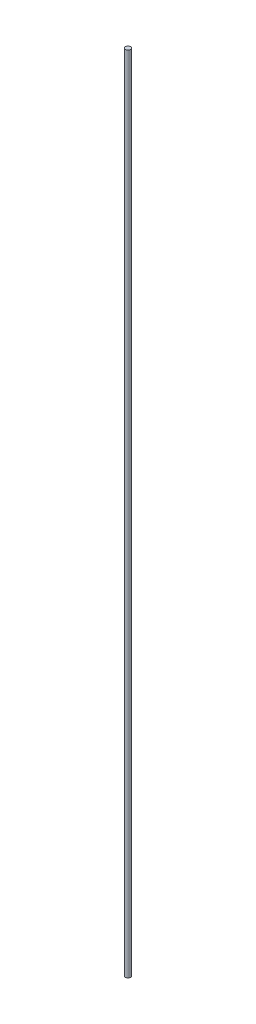
ISO-10303-21;
HEADER;
FILE_DESCRIPTION(('STEP AP214'),'2;1');
FILE_NAME('part.step','',(''),(''),'','','');
FILE_SCHEMA(('AUTOMOTIVE_DESIGN { 1 0 10303 214 1 1 1 1 }'));
ENDSEC;
DATA;
#1=APPLICATION_CONTEXT('core data for automotive mechanical design processes');
#2=APPLICATION_PROTOCOL_DEFINITION('international standard','automotive_design',2000,#1);
#3=PRODUCT_CONTEXT('',#1,'mechanical');
#4=PRODUCT('Part','Part','',(#3));
#5=PRODUCT_RELATED_PRODUCT_CATEGORY('part','',(#4));
#6=PRODUCT_DEFINITION_FORMATION('','',#4);
#7=PRODUCT_DEFINITION_CONTEXT('part definition',#1,'design');
#8=PRODUCT_DEFINITION('design','',#6,#7);
#9=PRODUCT_DEFINITION_SHAPE('','',#8);
#10=(LENGTH_UNIT() NAMED_UNIT(*) SI_UNIT(.MILLI.,.METRE.));
#11=(NAMED_UNIT(*) PLANE_ANGLE_UNIT() SI_UNIT($,.RADIAN.));
#12=(NAMED_UNIT(*) SI_UNIT($,.STERADIAN.) SOLID_ANGLE_UNIT());
#13=UNCERTAINTY_MEASURE_WITH_UNIT(LENGTH_MEASURE(1.E-05),#10,'distance_accuracy_value','');
#14=(GEOMETRIC_REPRESENTATION_CONTEXT(3) GLOBAL_UNCERTAINTY_ASSIGNED_CONTEXT((#13)) GLOBAL_UNIT_ASSIGNED_CONTEXT((#10,
#11,#12)) REPRESENTATION_CONTEXT('',''));
#15=CARTESIAN_POINT('',(0.,0.,0.));
#16=DIRECTION('',(0.,0.,1.));
#17=DIRECTION('',(1.,0.,0.));
#18=AXIS2_PLACEMENT_3D('',#15,#16,#17);
#19=CARTESIAN_POINT('',(0.,0.,0.));
#20=DIRECTION('',(0.,1.,0.));
#21=DIRECTION('',(0.,0.,1.));
#22=AXIS2_PLACEMENT_3D('',#19,#20,#21);
#23=PLANE('',#22);
#24=CARTESIAN_POINT('',(0.,0.,0.));
#25=DIRECTION('',(0.,1.,0.));
#26=DIRECTION('',(0.,0.,1.));
#27=AXIS2_PLACEMENT_3D('',#24,#25,#26);
#28=CIRCLE('',#27,6.35);
#29=CARTESIAN_POINT('',(0.,0.,6.35));
#30=VERTEX_POINT('',#29);
#31=EDGE_CURVE('E43',#30,#30,#28,.T.);
#32=ORIENTED_EDGE('',*,*,#31,.F.);
#33=EDGE_LOOP('',(#32));
#34=FACE_BOUND('',#33,.T.);
#35=ADVANCED_FACE('F37',(#34),#23,.F.);
#36=CARTESIAN_POINT('',(0.,1999.996,0.));
#37=DIRECTION('',(0.,1.,0.));
#38=DIRECTION('',(0.,0.,1.));
#39=AXIS2_PLACEMENT_3D('',#36,#37,#38);
#40=PLANE('',#39);
#41=CARTESIAN_POINT('',(0.,1999.996,0.));
#42=DIRECTION('',(0.,1.,0.));
#43=DIRECTION('',(0.,0.,1.));
#44=AXIS2_PLACEMENT_3D('',#41,#42,#43);
#45=CIRCLE('',#44,6.35);
#46=CARTESIAN_POINT('',(0.,1999.996,6.35));
#47=VERTEX_POINT('',#46);
#48=EDGE_CURVE('E11',#47,#47,#45,.T.);
#49=ORIENTED_EDGE('',*,*,#48,.T.);
#50=EDGE_LOOP('',(#49));
#51=FACE_BOUND('',#50,.T.);
#52=ADVANCED_FACE('F52',(#51),#40,.T.);
#53=CARTESIAN_POINT('',(0.,0.,0.));
#54=DIRECTION('',(0.,1.,0.));
#55=DIRECTION('',(0.,0.,1.));
#56=AXIS2_PLACEMENT_3D('',#53,#54,#55);
#57=CYLINDRICAL_SURFACE('',#56,6.35);
#58=ORIENTED_EDGE('',*,*,#48,.F.);
#59=EDGE_LOOP('',(#58));
#60=FACE_BOUND('',#59,.T.);
#61=ORIENTED_EDGE('',*,*,#31,.T.);
#62=EDGE_LOOP('',(#61));
#63=FACE_BOUND('',#62,.T.);
#64=ADVANCED_FACE('F49',(#60,#63),#57,.T.);
#65=CLOSED_SHELL('',(#35,#52,#64));
#66=MANIFOLD_SOLID_BREP('B2',#65);
#67=ADVANCED_BREP_SHAPE_REPRESENTATION('',(#18,#66),#14);
#68=SHAPE_DEFINITION_REPRESENTATION(#9,#67);
ENDSEC;
END-ISO-10303-21;
